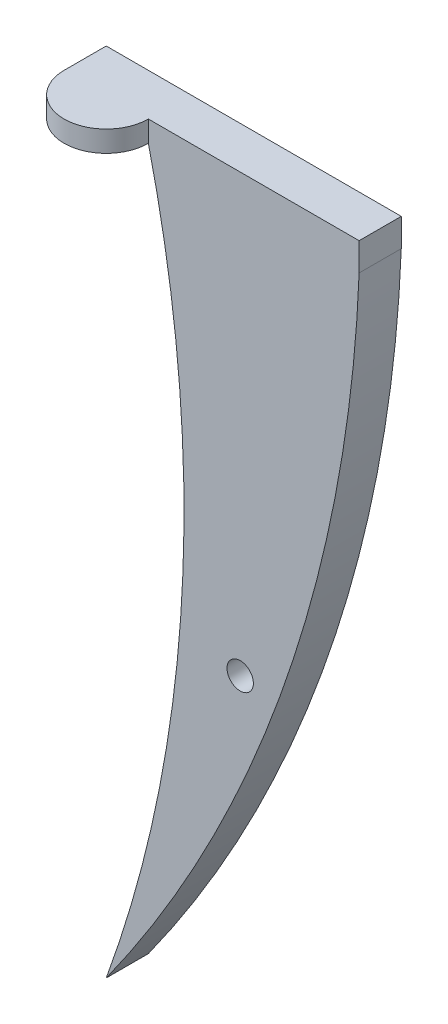
ISO-10303-21;
HEADER;
FILE_DESCRIPTION(('STEP AP214'),'2;1');
FILE_NAME('part.step','',(''),(''),'','','');
FILE_SCHEMA(('AUTOMOTIVE_DESIGN { 1 0 10303 214 1 1 1 1 }'));
ENDSEC;
DATA;
#1=APPLICATION_CONTEXT('core data for automotive mechanical design processes');
#2=APPLICATION_PROTOCOL_DEFINITION('international standard','automotive_design',2000,#1);
#3=PRODUCT_CONTEXT('',#1,'mechanical');
#4=PRODUCT('Part','Part','',(#3));
#5=PRODUCT_RELATED_PRODUCT_CATEGORY('part','',(#4));
#6=PRODUCT_DEFINITION_FORMATION('','',#4);
#7=PRODUCT_DEFINITION_CONTEXT('part definition',#1,'design');
#8=PRODUCT_DEFINITION('design','',#6,#7);
#9=PRODUCT_DEFINITION_SHAPE('','',#8);
#10=(LENGTH_UNIT() NAMED_UNIT(*) SI_UNIT(.MILLI.,.METRE.));
#11=(NAMED_UNIT(*) PLANE_ANGLE_UNIT() SI_UNIT($,.RADIAN.));
#12=(NAMED_UNIT(*) SI_UNIT($,.STERADIAN.) SOLID_ANGLE_UNIT());
#13=UNCERTAINTY_MEASURE_WITH_UNIT(LENGTH_MEASURE(1.E-05),#10,'distance_accuracy_value','');
#14=(GEOMETRIC_REPRESENTATION_CONTEXT(3) GLOBAL_UNCERTAINTY_ASSIGNED_CONTEXT((#13)) GLOBAL_UNIT_ASSIGNED_CONTEXT((#10,
#11,#12)) REPRESENTATION_CONTEXT('',''));
#15=CARTESIAN_POINT('',(0.,0.,0.));
#16=DIRECTION('',(0.,0.,1.));
#17=DIRECTION('',(1.,0.,0.));
#18=AXIS2_PLACEMENT_3D('',#15,#16,#17);
#19=CARTESIAN_POINT('',(17.78,92.202,2.54));
#20=DIRECTION('',(0.,0.,-1.));
#21=DIRECTION('',(-1.,0.,0.));
#22=AXIS2_PLACEMENT_3D('',#19,#20,#21);
#23=PLANE('',#22);
#24=CARTESIAN_POINT('',(3.4468955220599,39.6200228350106,2.54));
#25=DIRECTION('',(0.,0.,1.));
#26=DIRECTION('',(1.,0.,0.));
#27=AXIS2_PLACEMENT_3D('',#24,#25,#26);
#28=CIRCLE('',#27,1.5875);
#29=CARTESIAN_POINT('',(5.0343955220599,39.6200228350106,2.54));
#30=VERTEX_POINT('',#29);
#31=EDGE_CURVE('E205',#30,#30,#28,.T.);
#32=ORIENTED_EDGE('',*,*,#31,.F.);
#33=EDGE_LOOP('',(#32));
#34=FACE_BOUND('',#33,.T.);
#35=CARTESIAN_POINT('',(-145.670168631569,95.26982308931,2.54));
#36=DIRECTION('',(0.,0.,1.));
#37=DIRECTION('',(1.,0.,0.));
#38=AXIS2_PLACEMENT_3D('',#35,#36,#37);
#39=CIRCLE('',#38,163.576908325644);
#40=CARTESIAN_POINT('',(-12.7,0.,2.54));
#41=VERTEX_POINT('',#40);
#42=CARTESIAN_POINT('',(17.78,88.831864430853,2.54));
#43=VERTEX_POINT('',#42);
#44=EDGE_CURVE('E134',#41,#43,#39,.T.);
#45=ORIENTED_EDGE('',*,*,#44,.T.);
#46=DIRECTION('',(0.,-1.,0.));
#47=VECTOR('',#46,1.);
#48=CARTESIAN_POINT('',(17.78,92.202,2.54));
#49=LINE('',#48,#47);
#50=CARTESIAN_POINT('',(17.78,92.202,2.54));
#51=VERTEX_POINT('',#50);
#52=EDGE_CURVE('E12',#51,#43,#49,.T.);
#53=ORIENTED_EDGE('',*,*,#52,.F.);
#54=DIRECTION('',(1.,0.,0.));
#55=VECTOR('',#54,1.);
#56=CARTESIAN_POINT('',(17.78,92.202,2.54));
#57=LINE('',#56,#55);
#58=CARTESIAN_POINT('',(-7.61999999999999,92.202,2.54));
#59=VERTEX_POINT('',#58);
#60=EDGE_CURVE('E150',#59,#51,#57,.T.);
#61=ORIENTED_EDGE('',*,*,#60,.F.);
#62=DIRECTION('',(0.,1.,0.));
#63=VECTOR('',#62,1.);
#64=CARTESIAN_POINT('',(-7.62,92.202,2.54));
#65=LINE('',#64,#63);
#66=CARTESIAN_POINT('',(-7.62,89.662,2.54));
#67=VERTEX_POINT('',#66);
#68=EDGE_CURVE('E163',#67,#59,#65,.T.);
#69=ORIENTED_EDGE('',*,*,#68,.F.);
#70=CARTESIAN_POINT('',(-159.474143935706,53.2907248688785,2.54));
#71=DIRECTION('',(0.,0.,1.));
#72=DIRECTION('',(1.,0.,0.));
#73=AXIS2_PLACEMENT_3D('',#70,#71,#72);
#74=CIRCLE('',#73,156.149129632893);
#75=EDGE_CURVE('E147',#41,#67,#74,.T.);
#76=ORIENTED_EDGE('',*,*,#75,.F.);
#77=EDGE_LOOP('',(#45,#53,#61,#69,#76));
#78=FACE_BOUND('',#77,.T.);
#79=ADVANCED_FACE('F74',(#34,#78),#23,.F.);
#80=CARTESIAN_POINT('',(17.78,92.202,2.54));
#81=DIRECTION('',(-1.,0.,0.));
#82=DIRECTION('',(0.,0.,1.));
#83=AXIS2_PLACEMENT_3D('',#80,#81,#82);
#84=PLANE('',#83);
#85=DIRECTION('',(0.,0.,1.));
#86=VECTOR('',#85,1.);
#87=CARTESIAN_POINT('',(17.78,88.831864430853,-2.54));
#88=LINE('',#87,#86);
#89=CARTESIAN_POINT('',(17.78,88.831864430853,-2.54));
#90=VERTEX_POINT('',#89);
#91=EDGE_CURVE('E131',#90,#43,#88,.T.);
#92=ORIENTED_EDGE('',*,*,#91,.F.);
#93=DIRECTION('',(0.,-1.,0.));
#94=VECTOR('',#93,1.);
#95=CARTESIAN_POINT('',(17.78,92.202,-2.54));
#96=LINE('',#95,#94);
#97=CARTESIAN_POINT('',(17.78,92.202,-2.54));
#98=VERTEX_POINT('',#97);
#99=EDGE_CURVE('E83',#98,#90,#96,.T.);
#100=ORIENTED_EDGE('',*,*,#99,.F.);
#101=DIRECTION('',(0.,0.,-1.));
#102=VECTOR('',#101,1.);
#103=CARTESIAN_POINT('',(17.78,92.202,2.54));
#104=LINE('',#103,#102);
#105=EDGE_CURVE('E96',#51,#98,#104,.T.);
#106=ORIENTED_EDGE('',*,*,#105,.F.);
#107=ORIENTED_EDGE('',*,*,#52,.T.);
#108=EDGE_LOOP('',(#92,#100,#106,#107));
#109=FACE_BOUND('',#108,.T.);
#110=ADVANCED_FACE('F149',(#109),#84,.F.);
#111=CARTESIAN_POINT('',(17.78,92.202,-2.54));
#112=DIRECTION('',(0.,0.,1.));
#113=DIRECTION('',(1.,0.,0.));
#114=AXIS2_PLACEMENT_3D('',#111,#112,#113);
#115=PLANE('',#114);
#116=CARTESIAN_POINT('',(3.4468955220599,39.6200228350106,-2.54));
#117=DIRECTION('',(0.,0.,1.));
#118=DIRECTION('',(1.,0.,0.));
#119=AXIS2_PLACEMENT_3D('',#116,#117,#118);
#120=CIRCLE('',#119,1.5875);
#121=CARTESIAN_POINT('',(5.0343955220599,39.6200228350106,-2.54));
#122=VERTEX_POINT('',#121);
#123=EDGE_CURVE('E78',#122,#122,#120,.T.);
#124=ORIENTED_EDGE('',*,*,#123,.T.);
#125=EDGE_LOOP('',(#124));
#126=FACE_BOUND('',#125,.T.);
#127=CARTESIAN_POINT('',(-145.670168631569,95.26982308931,-2.54));
#128=DIRECTION('',(0.,0.,1.));
#129=DIRECTION('',(1.,0.,0.));
#130=AXIS2_PLACEMENT_3D('',#127,#128,#129);
#131=CIRCLE('',#130,163.576908325644);
#132=CARTESIAN_POINT('',(-12.7,0.,-2.54));
#133=VERTEX_POINT('',#132);
#134=EDGE_CURVE('E137',#133,#90,#131,.T.);
#135=ORIENTED_EDGE('',*,*,#134,.F.);
#136=CARTESIAN_POINT('',(-159.474143935706,53.2907248688785,-2.54));
#137=DIRECTION('',(0.,0.,1.));
#138=DIRECTION('',(1.,0.,0.));
#139=AXIS2_PLACEMENT_3D('',#136,#137,#138);
#140=CIRCLE('',#139,156.149129632893);
#141=CARTESIAN_POINT('',(-7.62,89.662,-2.54));
#142=VERTEX_POINT('',#141);
#143=EDGE_CURVE('E199',#133,#142,#140,.T.);
#144=ORIENTED_EDGE('',*,*,#143,.T.);
#145=DIRECTION('',(-1.,0.,0.));
#146=VECTOR('',#145,1.);
#147=CARTESIAN_POINT('',(0.,89.662,-2.54));
#148=LINE('',#147,#146);
#149=CARTESIAN_POINT('',(-17.78,89.662,-2.54));
#150=VERTEX_POINT('',#149);
#151=EDGE_CURVE('E196',#142,#150,#148,.T.);
#152=ORIENTED_EDGE('',*,*,#151,.T.);
#153=DIRECTION('',(0.,-1.,0.));
#154=VECTOR('',#153,1.);
#155=CARTESIAN_POINT('',(-17.78,92.202,-2.54));
#156=LINE('',#155,#154);
#157=CARTESIAN_POINT('',(-17.78,92.202,-2.54));
#158=VERTEX_POINT('',#157);
#159=EDGE_CURVE('E152',#158,#150,#156,.T.);
#160=ORIENTED_EDGE('',*,*,#159,.F.);
#161=DIRECTION('',(-1.,0.,0.));
#162=VECTOR('',#161,1.);
#163=CARTESIAN_POINT('',(17.78,92.202,-2.54));
#164=LINE('',#163,#162);
#165=EDGE_CURVE('E91',#98,#158,#164,.T.);
#166=ORIENTED_EDGE('',*,*,#165,.F.);
#167=ORIENTED_EDGE('',*,*,#99,.T.);
#168=EDGE_LOOP('',(#135,#144,#152,#160,#166,#167));
#169=FACE_BOUND('',#168,.T.);
#170=ADVANCED_FACE('F212',(#126,#169),#115,.F.);
#171=CARTESIAN_POINT('',(0.,92.202,0.));
#172=DIRECTION('',(0.,1.,0.));
#173=DIRECTION('',(0.,0.,1.));
#174=AXIS2_PLACEMENT_3D('',#171,#172,#173);
#175=PLANE('',#174);
#176=CARTESIAN_POINT('',(-12.7,92.202,2.54));
#177=DIRECTION('',(0.,1.,0.));
#178=DIRECTION('',(0.,0.,1.));
#179=AXIS2_PLACEMENT_3D('',#176,#177,#178);
#180=CIRCLE('',#179,5.08);
#181=CARTESIAN_POINT('',(-17.78,92.202,2.54));
#182=VERTEX_POINT('',#181);
#183=EDGE_CURVE('E175',#182,#59,#180,.T.);
#184=ORIENTED_EDGE('',*,*,#183,.T.);
#185=ORIENTED_EDGE('',*,*,#60,.T.);
#186=ORIENTED_EDGE('',*,*,#105,.T.);
#187=ORIENTED_EDGE('',*,*,#165,.T.);
#188=DIRECTION('',(0.,0.,1.));
#189=VECTOR('',#188,1.);
#190=CARTESIAN_POINT('',(-17.78,92.202,2.54));
#191=LINE('',#190,#189);
#192=EDGE_CURVE('E154',#158,#182,#191,.T.);
#193=ORIENTED_EDGE('',*,*,#192,.T.);
#194=EDGE_LOOP('',(#184,#185,#186,#187,#193));
#195=FACE_BOUND('',#194,.T.);
#196=ADVANCED_FACE('F174',(#195),#175,.T.);
#197=CARTESIAN_POINT('',(-17.78,89.662,7.62));
#198=DIRECTION('',(0.,1.,0.));
#199=DIRECTION('',(0.,0.,1.));
#200=AXIS2_PLACEMENT_3D('',#197,#198,#199);
#201=PLANE('',#200);
#202=CARTESIAN_POINT('',(-12.7,89.662,2.54));
#203=DIRECTION('',(0.,1.,0.));
#204=DIRECTION('',(0.,0.,1.));
#205=AXIS2_PLACEMENT_3D('',#202,#203,#204);
#206=CIRCLE('',#205,5.08);
#207=CARTESIAN_POINT('',(-17.78,89.662,2.54));
#208=VERTEX_POINT('',#207);
#209=EDGE_CURVE('E183',#208,#67,#206,.T.);
#210=ORIENTED_EDGE('',*,*,#209,.F.);
#211=DIRECTION('',(0.,0.,1.));
#212=VECTOR('',#211,1.);
#213=CARTESIAN_POINT('',(-17.78,89.662,-2.54));
#214=LINE('',#213,#212);
#215=EDGE_CURVE('E179',#150,#208,#214,.T.);
#216=ORIENTED_EDGE('',*,*,#215,.F.);
#217=ORIENTED_EDGE('',*,*,#151,.F.);
#218=DIRECTION('',(0.,0.,1.));
#219=VECTOR('',#218,1.);
#220=CARTESIAN_POINT('',(-7.62,89.662,-2.54));
#221=LINE('',#220,#219);
#222=EDGE_CURVE('E192',#142,#67,#221,.T.);
#223=ORIENTED_EDGE('',*,*,#222,.T.);
#224=EDGE_LOOP('',(#210,#216,#217,#223));
#225=FACE_BOUND('',#224,.T.);
#226=ADVANCED_FACE('F235',(#225),#201,.F.);
#227=CARTESIAN_POINT('',(-17.78,92.202,2.54));
#228=DIRECTION('',(1.,0.,0.));
#229=DIRECTION('',(0.,0.,-1.));
#230=AXIS2_PLACEMENT_3D('',#227,#228,#229);
#231=PLANE('',#230);
#232=ORIENTED_EDGE('',*,*,#159,.T.);
#233=ORIENTED_EDGE('',*,*,#215,.T.);
#234=DIRECTION('',(0.,1.,0.));
#235=VECTOR('',#234,1.);
#236=CARTESIAN_POINT('',(-17.78,89.662,2.54));
#237=LINE('',#236,#235);
#238=EDGE_CURVE('E167',#208,#182,#237,.T.);
#239=ORIENTED_EDGE('',*,*,#238,.T.);
#240=ORIENTED_EDGE('',*,*,#192,.F.);
#241=EDGE_LOOP('',(#232,#233,#239,#240));
#242=FACE_BOUND('',#241,.T.);
#243=ADVANCED_FACE('F76',(#242),#231,.F.);
#244=CARTESIAN_POINT('',(-12.7,89.662,2.54));
#245=DIRECTION('',(0.,1.,0.));
#246=DIRECTION('',(0.,0.,1.));
#247=AXIS2_PLACEMENT_3D('',#244,#245,#246);
#248=CYLINDRICAL_SURFACE('',#247,5.08);
#249=ORIENTED_EDGE('',*,*,#183,.F.);
#250=ORIENTED_EDGE('',*,*,#238,.F.);
#251=ORIENTED_EDGE('',*,*,#209,.T.);
#252=ORIENTED_EDGE('',*,*,#68,.T.);
#253=EDGE_LOOP('',(#249,#250,#251,#252));
#254=FACE_BOUND('',#253,.T.);
#255=ADVANCED_FACE('F238',(#254),#248,.T.);
#256=CARTESIAN_POINT('',(-159.474143935706,53.2907248688785,-2.54));
#257=DIRECTION('',(0.,0.,1.));
#258=DIRECTION('',(1.,0.,0.));
#259=AXIS2_PLACEMENT_3D('',#256,#257,#258);
#260=CYLINDRICAL_SURFACE('',#259,156.149129632893);
#261=ORIENTED_EDGE('',*,*,#75,.T.);
#262=ORIENTED_EDGE('',*,*,#222,.F.);
#263=ORIENTED_EDGE('',*,*,#143,.F.);
#264=DIRECTION('',(0.,0.,1.));
#265=VECTOR('',#264,1.);
#266=CARTESIAN_POINT('',(-12.7,0.,-2.54));
#267=LINE('',#266,#265);
#268=EDGE_CURVE('E171',#133,#41,#267,.T.);
#269=ORIENTED_EDGE('',*,*,#268,.T.);
#270=EDGE_LOOP('',(#261,#262,#263,#269));
#271=FACE_BOUND('',#270,.T.);
#272=ADVANCED_FACE('F221',(#271),#260,.F.);
#273=CARTESIAN_POINT('',(-145.670168631569,95.26982308931,-2.54));
#274=DIRECTION('',(0.,0.,1.));
#275=DIRECTION('',(1.,0.,0.));
#276=AXIS2_PLACEMENT_3D('',#273,#274,#275);
#277=CYLINDRICAL_SURFACE('',#276,163.576908325644);
#278=ORIENTED_EDGE('',*,*,#44,.F.);
#279=ORIENTED_EDGE('',*,*,#268,.F.);
#280=ORIENTED_EDGE('',*,*,#134,.T.);
#281=ORIENTED_EDGE('',*,*,#91,.T.);
#282=EDGE_LOOP('',(#278,#279,#280,#281));
#283=FACE_BOUND('',#282,.T.);
#284=ADVANCED_FACE('F133',(#283),#277,.T.);
#285=CARTESIAN_POINT('',(3.4468955220599,39.6200228350106,-2.540025));
#286=DIRECTION('',(0.,0.,1.));
#287=DIRECTION('',(1.,0.,0.));
#288=AXIS2_PLACEMENT_3D('',#285,#286,#287);
#289=CYLINDRICAL_SURFACE('',#288,1.5875);
#290=ORIENTED_EDGE('',*,*,#31,.T.);
#291=EDGE_LOOP('',(#290));
#292=FACE_BOUND('',#291,.T.);
#293=ORIENTED_EDGE('',*,*,#123,.F.);
#294=EDGE_LOOP('',(#293));
#295=FACE_BOUND('',#294,.T.);
#296=ADVANCED_FACE('F215',(#292,#295),#289,.F.);
#297=CLOSED_SHELL('',(#79,#110,#170,#196,#226,#243,#255,#272,#284,#296));
#298=MANIFOLD_SOLID_BREP('B2',#297);
#299=ADVANCED_BREP_SHAPE_REPRESENTATION('',(#18,#298),#14);
#300=SHAPE_DEFINITION_REPRESENTATION(#9,#299);
ENDSEC;
END-ISO-10303-21;
